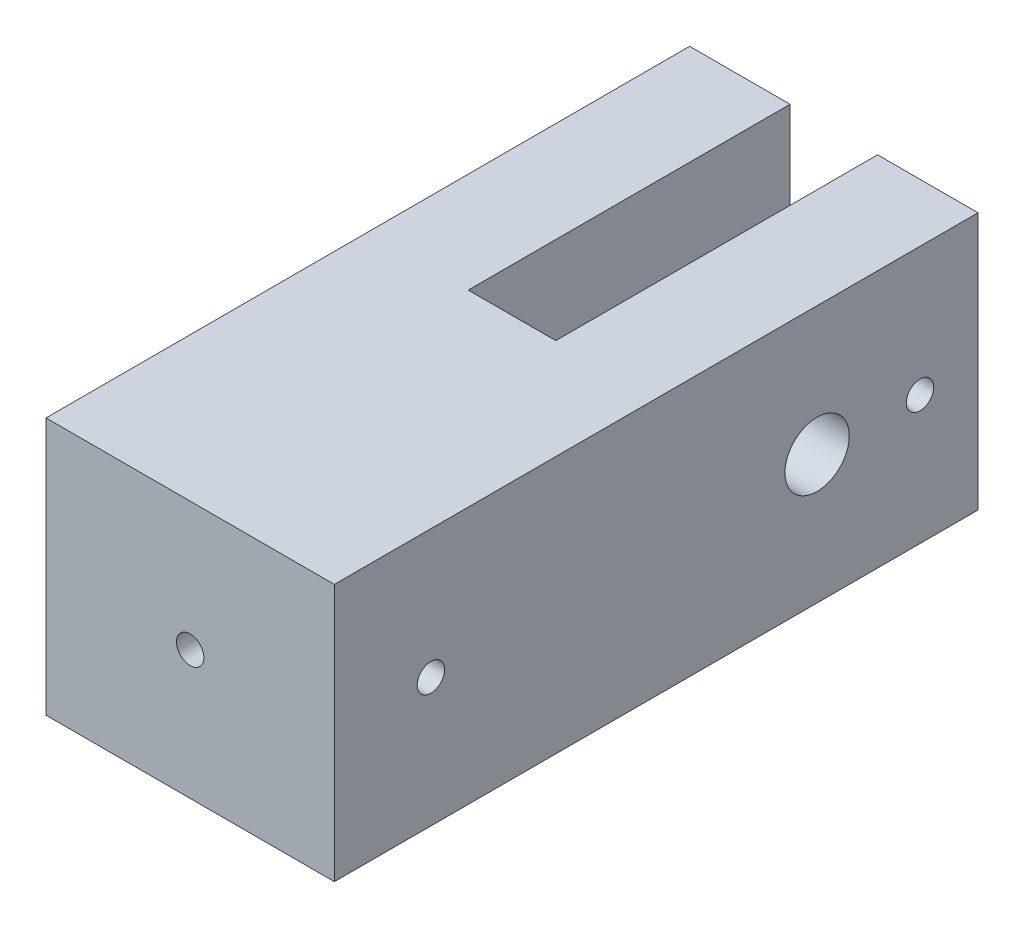
ISO-10303-21;
HEADER;
FILE_DESCRIPTION(('STEP AP214'),'2;1');
FILE_NAME('part.step','',(''),(''),'','','');
FILE_SCHEMA(('AUTOMOTIVE_DESIGN { 1 0 10303 214 1 1 1 1 }'));
ENDSEC;
DATA;
#1=APPLICATION_CONTEXT('core data for automotive mechanical design processes');
#2=APPLICATION_PROTOCOL_DEFINITION('international standard','automotive_design',2000,#1);
#3=PRODUCT_CONTEXT('',#1,'mechanical');
#4=PRODUCT('Part','Part','',(#3));
#5=PRODUCT_RELATED_PRODUCT_CATEGORY('part','',(#4));
#6=PRODUCT_DEFINITION_FORMATION('','',#4);
#7=PRODUCT_DEFINITION_CONTEXT('part definition',#1,'design');
#8=PRODUCT_DEFINITION('design','',#6,#7);
#9=PRODUCT_DEFINITION_SHAPE('','',#8);
#10=(LENGTH_UNIT() NAMED_UNIT(*) SI_UNIT(.MILLI.,.METRE.));
#11=(NAMED_UNIT(*) PLANE_ANGLE_UNIT() SI_UNIT($,.RADIAN.));
#12=(NAMED_UNIT(*) SI_UNIT($,.STERADIAN.) SOLID_ANGLE_UNIT());
#13=UNCERTAINTY_MEASURE_WITH_UNIT(LENGTH_MEASURE(1.E-05),#10,'distance_accuracy_value','');
#14=(GEOMETRIC_REPRESENTATION_CONTEXT(3) GLOBAL_UNCERTAINTY_ASSIGNED_CONTEXT((#13)) GLOBAL_UNIT_ASSIGNED_CONTEXT((#10,
#11,#12)) REPRESENTATION_CONTEXT('',''));
#15=CARTESIAN_POINT('',(0.,0.,0.));
#16=DIRECTION('',(0.,0.,1.));
#17=DIRECTION('',(1.,0.,0.));
#18=AXIS2_PLACEMENT_3D('',#15,#16,#17);
#19=CARTESIAN_POINT('',(0.,0.,0.));
#20=DIRECTION('',(0.,0.,1.));
#21=DIRECTION('',(1.,0.,0.));
#22=AXIS2_PLACEMENT_3D('',#19,#20,#21);
#23=PLANE('',#22);
#24=DIRECTION('',(1.,0.,0.));
#25=VECTOR('',#24,1.);
#26=CARTESIAN_POINT('',(-14.224,-12.7,0.));
#27=LINE('',#26,#25);
#28=CARTESIAN_POINT('',(4.318,-12.7,0.));
#29=VERTEX_POINT('',#28);
#30=CARTESIAN_POINT('',(14.224,-12.7,0.));
#31=VERTEX_POINT('',#30);
#32=EDGE_CURVE('E81',#29,#31,#27,.T.);
#33=ORIENTED_EDGE('',*,*,#32,.F.);
#34=DIRECTION('',(0.,1.,0.));
#35=VECTOR('',#34,1.);
#36=CARTESIAN_POINT('',(4.318,-12.7,0.));
#37=LINE('',#36,#35);
#38=CARTESIAN_POINT('',(4.318,12.7,0.));
#39=VERTEX_POINT('',#38);
#40=EDGE_CURVE('E172',#29,#39,#37,.T.);
#41=ORIENTED_EDGE('',*,*,#40,.T.);
#42=DIRECTION('',(-1.,0.,0.));
#43=VECTOR('',#42,1.);
#44=CARTESIAN_POINT('',(-14.224,12.7,0.));
#45=LINE('',#44,#43);
#46=CARTESIAN_POINT('',(14.224,12.7,0.));
#47=VERTEX_POINT('',#46);
#48=EDGE_CURVE('E199',#47,#39,#45,.T.);
#49=ORIENTED_EDGE('',*,*,#48,.F.);
#50=DIRECTION('',(0.,1.,0.));
#51=VECTOR('',#50,1.);
#52=CARTESIAN_POINT('',(14.224,12.7,0.));
#53=LINE('',#52,#51);
#54=EDGE_CURVE('E181',#31,#47,#53,.T.);
#55=ORIENTED_EDGE('',*,*,#54,.F.);
#56=EDGE_LOOP('',(#33,#41,#49,#55));
#57=FACE_BOUND('',#56,.T.);
#58=ADVANCED_FACE('F35',(#57),#23,.F.);
#59=CARTESIAN_POINT('',(14.224,12.7,63.5));
#60=DIRECTION('',(-1.,0.,0.));
#61=DIRECTION('',(0.,-1.,0.));
#62=AXIS2_PLACEMENT_3D('',#59,#60,#61);
#63=PLANE('',#62);
#64=CARTESIAN_POINT('',(14.224,0.,53.975));
#65=DIRECTION('',(1.,0.,0.));
#66=DIRECTION('',(0.,0.,-1.));
#67=AXIS2_PLACEMENT_3D('',#64,#65,#66);
#68=CIRCLE('',#67,1.35254999999999);
#69=CARTESIAN_POINT('',(14.224,0.,52.62245));
#70=VERTEX_POINT('',#69);
#71=EDGE_CURVE('E131',#70,#70,#68,.T.);
#72=ORIENTED_EDGE('',*,*,#71,.F.);
#73=EDGE_LOOP('',(#72));
#74=FACE_BOUND('',#73,.T.);
#75=CARTESIAN_POINT('',(14.224,0.,5.715));
#76=DIRECTION('',(1.,0.,0.));
#77=DIRECTION('',(0.,0.,-1.));
#78=AXIS2_PLACEMENT_3D('',#75,#76,#77);
#79=CIRCLE('',#78,1.35254999999999);
#80=CARTESIAN_POINT('',(14.224,0.,4.36245000000001));
#81=VERTEX_POINT('',#80);
#82=EDGE_CURVE('E130',#81,#81,#79,.T.);
#83=ORIENTED_EDGE('',*,*,#82,.F.);
#84=EDGE_LOOP('',(#83));
#85=FACE_BOUND('',#84,.T.);
#86=CARTESIAN_POINT('',(14.224,0.,15.875));
#87=DIRECTION('',(-1.,0.,0.));
#88=DIRECTION('',(0.,0.,1.));
#89=AXIS2_PLACEMENT_3D('',#86,#87,#88);
#90=CIRCLE('',#89,3.17500000000001);
#91=CARTESIAN_POINT('',(14.224,0.,19.05));
#92=VERTEX_POINT('',#91);
#93=EDGE_CURVE('E156',#92,#92,#90,.T.);
#94=ORIENTED_EDGE('',*,*,#93,.T.);
#95=EDGE_LOOP('',(#94));
#96=FACE_BOUND('',#95,.T.);
#97=ORIENTED_EDGE('',*,*,#54,.T.);
#98=DIRECTION('',(0.,0.,-1.));
#99=VECTOR('',#98,1.);
#100=CARTESIAN_POINT('',(14.224,12.7,63.5));
#101=LINE('',#100,#99);
#102=CARTESIAN_POINT('',(14.224,12.7,63.5));
#103=VERTEX_POINT('',#102);
#104=EDGE_CURVE('E11',#103,#47,#101,.T.);
#105=ORIENTED_EDGE('',*,*,#104,.F.);
#106=DIRECTION('',(0.,1.,0.));
#107=VECTOR('',#106,1.);
#108=CARTESIAN_POINT('',(14.224,12.7,63.5));
#109=LINE('',#108,#107);
#110=CARTESIAN_POINT('',(14.224,-12.7,63.5));
#111=VERTEX_POINT('',#110);
#112=EDGE_CURVE('E188',#111,#103,#109,.T.);
#113=ORIENTED_EDGE('',*,*,#112,.F.);
#114=DIRECTION('',(0.,0.,-1.));
#115=VECTOR('',#114,1.);
#116=CARTESIAN_POINT('',(14.224,-12.7,63.5));
#117=LINE('',#116,#115);
#118=EDGE_CURVE('E195',#111,#31,#117,.T.);
#119=ORIENTED_EDGE('',*,*,#118,.T.);
#120=EDGE_LOOP('',(#97,#105,#113,#119));
#121=FACE_BOUND('',#120,.T.);
#122=ADVANCED_FACE('F37',(#74,#85,#96,#121),#63,.F.);
#123=CARTESIAN_POINT('',(-14.224,12.7,63.5));
#124=DIRECTION('',(0.,-1.,0.));
#125=DIRECTION('',(0.,0.,-1.));
#126=AXIS2_PLACEMENT_3D('',#123,#124,#125);
#127=PLANE('',#126);
#128=ORIENTED_EDGE('',*,*,#48,.T.);
#129=DIRECTION('',(0.,0.,-1.));
#130=VECTOR('',#129,1.);
#131=CARTESIAN_POINT('',(4.318,12.7,31.75));
#132=LINE('',#131,#130);
#133=CARTESIAN_POINT('',(4.318,12.7,31.75));
#134=VERTEX_POINT('',#133);
#135=EDGE_CURVE('E164',#134,#39,#132,.T.);
#136=ORIENTED_EDGE('',*,*,#135,.F.);
#137=DIRECTION('',(1.,0.,0.));
#138=VECTOR('',#137,1.);
#139=CARTESIAN_POINT('',(-4.318,12.7,31.75));
#140=LINE('',#139,#138);
#141=CARTESIAN_POINT('',(-4.318,12.7,31.75));
#142=VERTEX_POINT('',#141);
#143=EDGE_CURVE('E167',#142,#134,#140,.T.);
#144=ORIENTED_EDGE('',*,*,#143,.F.);
#145=DIRECTION('',(0.,0.,1.));
#146=VECTOR('',#145,1.);
#147=CARTESIAN_POINT('',(-4.318,12.7,31.75));
#148=LINE('',#147,#146);
#149=CARTESIAN_POINT('',(-4.318,12.7,0.));
#150=VERTEX_POINT('',#149);
#151=EDGE_CURVE('E174',#150,#142,#148,.T.);
#152=ORIENTED_EDGE('',*,*,#151,.F.);
#153=CARTESIAN_POINT('',(-14.224,12.7,0.));
#154=VERTEX_POINT('',#153);
#155=EDGE_CURVE('E198',#150,#154,#45,.T.);
#156=ORIENTED_EDGE('',*,*,#155,.T.);
#157=DIRECTION('',(0.,0.,-1.));
#158=VECTOR('',#157,1.);
#159=CARTESIAN_POINT('',(-14.224,12.7,63.5));
#160=LINE('',#159,#158);
#161=CARTESIAN_POINT('',(-14.224,12.7,63.5));
#162=VERTEX_POINT('',#161);
#163=EDGE_CURVE('E44',#162,#154,#160,.T.);
#164=ORIENTED_EDGE('',*,*,#163,.F.);
#165=DIRECTION('',(-1.,0.,0.));
#166=VECTOR('',#165,1.);
#167=CARTESIAN_POINT('',(-14.224,12.7,63.5));
#168=LINE('',#167,#166);
#169=EDGE_CURVE('E88',#103,#162,#168,.T.);
#170=ORIENTED_EDGE('',*,*,#169,.F.);
#171=ORIENTED_EDGE('',*,*,#104,.T.);
#172=EDGE_LOOP('',(#128,#136,#144,#152,#156,#164,#170,#171));
#173=FACE_BOUND('',#172,.T.);
#174=ADVANCED_FACE('F243',(#173),#127,.F.);
#175=CARTESIAN_POINT('',(-14.224,12.7,63.5));
#176=DIRECTION('',(1.,0.,0.));
#177=DIRECTION('',(0.,1.,0.));
#178=AXIS2_PLACEMENT_3D('',#175,#176,#177);
#179=PLANE('',#178);
#180=CARTESIAN_POINT('',(-14.224,0.,5.715));
#181=DIRECTION('',(-1.,0.,0.));
#182=DIRECTION('',(0.,0.,1.));
#183=AXIS2_PLACEMENT_3D('',#180,#181,#182);
#184=CIRCLE('',#183,1.35254999999999);
#185=CARTESIAN_POINT('',(-14.224,0.,7.06754999999999));
#186=VERTEX_POINT('',#185);
#187=EDGE_CURVE('E143',#186,#186,#184,.T.);
#188=ORIENTED_EDGE('',*,*,#187,.F.);
#189=EDGE_LOOP('',(#188));
#190=FACE_BOUND('',#189,.T.);
#191=CARTESIAN_POINT('',(-14.224,0.,53.975));
#192=DIRECTION('',(-1.,0.,0.));
#193=DIRECTION('',(0.,0.,1.));
#194=AXIS2_PLACEMENT_3D('',#191,#192,#193);
#195=CIRCLE('',#194,1.35254999999999);
#196=CARTESIAN_POINT('',(-14.224,0.,55.32755));
#197=VERTEX_POINT('',#196);
#198=EDGE_CURVE('E149',#197,#197,#195,.T.);
#199=ORIENTED_EDGE('',*,*,#198,.F.);
#200=EDGE_LOOP('',(#199));
#201=FACE_BOUND('',#200,.T.);
#202=CARTESIAN_POINT('',(-14.224,0.,15.875));
#203=DIRECTION('',(-1.,0.,0.));
#204=DIRECTION('',(0.,0.,1.));
#205=AXIS2_PLACEMENT_3D('',#202,#203,#204);
#206=CIRCLE('',#205,3.17500000000001);
#207=CARTESIAN_POINT('',(-14.224,0.,19.05));
#208=VERTEX_POINT('',#207);
#209=EDGE_CURVE('E155',#208,#208,#206,.T.);
#210=ORIENTED_EDGE('',*,*,#209,.F.);
#211=EDGE_LOOP('',(#210));
#212=FACE_BOUND('',#211,.T.);
#213=DIRECTION('',(0.,-1.,0.));
#214=VECTOR('',#213,1.);
#215=CARTESIAN_POINT('',(-14.224,12.7,0.));
#216=LINE('',#215,#214);
#217=CARTESIAN_POINT('',(-14.224,-12.7,0.));
#218=VERTEX_POINT('',#217);
#219=EDGE_CURVE('E202',#154,#218,#216,.T.);
#220=ORIENTED_EDGE('',*,*,#219,.T.);
#221=DIRECTION('',(0.,0.,-1.));
#222=VECTOR('',#221,1.);
#223=CARTESIAN_POINT('',(-14.224,-12.7,63.5));
#224=LINE('',#223,#222);
#225=CARTESIAN_POINT('',(-14.224,-12.7,63.5));
#226=VERTEX_POINT('',#225);
#227=EDGE_CURVE('E207',#226,#218,#224,.T.);
#228=ORIENTED_EDGE('',*,*,#227,.F.);
#229=DIRECTION('',(0.,-1.,0.));
#230=VECTOR('',#229,1.);
#231=CARTESIAN_POINT('',(-14.224,12.7,63.5));
#232=LINE('',#231,#230);
#233=EDGE_CURVE('E192',#162,#226,#232,.T.);
#234=ORIENTED_EDGE('',*,*,#233,.F.);
#235=ORIENTED_EDGE('',*,*,#163,.T.);
#236=EDGE_LOOP('',(#220,#228,#234,#235));
#237=FACE_BOUND('',#236,.T.);
#238=ADVANCED_FACE('F214',(#190,#201,#212,#237),#179,.F.);
#239=CARTESIAN_POINT('',(-14.224,-12.7,63.5));
#240=DIRECTION('',(0.,1.,0.));
#241=DIRECTION('',(0.,0.,1.));
#242=AXIS2_PLACEMENT_3D('',#239,#240,#241);
#243=PLANE('',#242);
#244=DIRECTION('',(1.,0.,0.));
#245=VECTOR('',#244,1.);
#246=CARTESIAN_POINT('',(-4.318,-12.7,31.75));
#247=LINE('',#246,#245);
#248=CARTESIAN_POINT('',(-4.318,-12.7,31.75));
#249=VERTEX_POINT('',#248);
#250=CARTESIAN_POINT('',(4.318,-12.7,31.75));
#251=VERTEX_POINT('',#250);
#252=EDGE_CURVE('E169',#249,#251,#247,.T.);
#253=ORIENTED_EDGE('',*,*,#252,.T.);
#254=DIRECTION('',(0.,0.,-1.));
#255=VECTOR('',#254,1.);
#256=CARTESIAN_POINT('',(4.318,-12.7,31.75));
#257=LINE('',#256,#255);
#258=EDGE_CURVE('E165',#251,#29,#257,.T.);
#259=ORIENTED_EDGE('',*,*,#258,.T.);
#260=ORIENTED_EDGE('',*,*,#32,.T.);
#261=ORIENTED_EDGE('',*,*,#118,.F.);
#262=DIRECTION('',(1.,0.,0.));
#263=VECTOR('',#262,1.);
#264=CARTESIAN_POINT('',(-14.224,-12.7,63.5));
#265=LINE('',#264,#263);
#266=EDGE_CURVE('E60',#226,#111,#265,.T.);
#267=ORIENTED_EDGE('',*,*,#266,.F.);
#268=ORIENTED_EDGE('',*,*,#227,.T.);
#269=CARTESIAN_POINT('',(-4.318,-12.7,0.));
#270=VERTEX_POINT('',#269);
#271=EDGE_CURVE('E190',#218,#270,#27,.T.);
#272=ORIENTED_EDGE('',*,*,#271,.T.);
#273=DIRECTION('',(0.,0.,1.));
#274=VECTOR('',#273,1.);
#275=CARTESIAN_POINT('',(-4.318,-12.7,31.75));
#276=LINE('',#275,#274);
#277=EDGE_CURVE('E51',#270,#249,#276,.T.);
#278=ORIENTED_EDGE('',*,*,#277,.T.);
#279=EDGE_LOOP('',(#253,#259,#260,#261,#267,#268,#272,#278));
#280=FACE_BOUND('',#279,.T.);
#281=ADVANCED_FACE('F220',(#280),#243,.F.);
#282=CARTESIAN_POINT('',(0.,0.,63.5));
#283=DIRECTION('',(0.,0.,1.));
#284=DIRECTION('',(1.,0.,0.));
#285=AXIS2_PLACEMENT_3D('',#282,#283,#284);
#286=PLANE('',#285);
#287=CARTESIAN_POINT('',(0.,0.,63.5));
#288=DIRECTION('',(0.,0.,-1.));
#289=DIRECTION('',(-1.,0.,0.));
#290=AXIS2_PLACEMENT_3D('',#287,#288,#289);
#291=CIRCLE('',#290,1.35255);
#292=CARTESIAN_POINT('',(-1.35254999999997,0.,63.5));
#293=VERTEX_POINT('',#292);
#294=EDGE_CURVE('E137',#293,#293,#291,.T.);
#295=ORIENTED_EDGE('',*,*,#294,.T.);
#296=EDGE_LOOP('',(#295));
#297=FACE_BOUND('',#296,.T.);
#298=ORIENTED_EDGE('',*,*,#112,.T.);
#299=ORIENTED_EDGE('',*,*,#169,.T.);
#300=ORIENTED_EDGE('',*,*,#233,.T.);
#301=ORIENTED_EDGE('',*,*,#266,.T.);
#302=EDGE_LOOP('',(#298,#299,#300,#301));
#303=FACE_BOUND('',#302,.T.);
#304=ADVANCED_FACE('F225',(#297,#303),#286,.T.);
#305=ORIENTED_EDGE('',*,*,#155,.F.);
#306=DIRECTION('',(0.,1.,0.));
#307=VECTOR('',#306,1.);
#308=CARTESIAN_POINT('',(-4.318,-12.7,0.));
#309=LINE('',#308,#307);
#310=EDGE_CURVE('E184',#270,#150,#309,.T.);
#311=ORIENTED_EDGE('',*,*,#310,.F.);
#312=ORIENTED_EDGE('',*,*,#271,.F.);
#313=ORIENTED_EDGE('',*,*,#219,.F.);
#314=EDGE_LOOP('',(#305,#311,#312,#313));
#315=FACE_BOUND('',#314,.T.);
#316=ADVANCED_FACE('F219',(#315),#23,.F.);
#317=CARTESIAN_POINT('',(4.318,-12.7,31.75));
#318=DIRECTION('',(1.,0.,0.));
#319=DIRECTION('',(0.,0.,-1.));
#320=AXIS2_PLACEMENT_3D('',#317,#318,#319);
#321=PLANE('',#320);
#322=CARTESIAN_POINT('',(4.318,0.,15.875));
#323=DIRECTION('',(1.,0.,0.));
#324=DIRECTION('',(0.,0.,-1.));
#325=AXIS2_PLACEMENT_3D('',#322,#323,#324);
#326=CIRCLE('',#325,3.17500000000001);
#327=CARTESIAN_POINT('',(4.318,0.,12.7));
#328=VERTEX_POINT('',#327);
#329=EDGE_CURVE('E161',#328,#328,#326,.T.);
#330=ORIENTED_EDGE('',*,*,#329,.T.);
#331=EDGE_LOOP('',(#330));
#332=FACE_BOUND('',#331,.T.);
#333=ORIENTED_EDGE('',*,*,#135,.T.);
#334=ORIENTED_EDGE('',*,*,#40,.F.);
#335=ORIENTED_EDGE('',*,*,#258,.F.);
#336=DIRECTION('',(0.,1.,0.));
#337=VECTOR('',#336,1.);
#338=CARTESIAN_POINT('',(4.318,-12.7,31.75));
#339=LINE('',#338,#337);
#340=EDGE_CURVE('E179',#251,#134,#339,.T.);
#341=ORIENTED_EDGE('',*,*,#340,.T.);
#342=EDGE_LOOP('',(#333,#334,#335,#341));
#343=FACE_BOUND('',#342,.T.);
#344=ADVANCED_FACE('F233',(#332,#343),#321,.F.);
#345=CARTESIAN_POINT('',(-4.318,-12.7,31.75));
#346=DIRECTION('',(0.,0.,1.));
#347=DIRECTION('',(1.,0.,0.));
#348=AXIS2_PLACEMENT_3D('',#345,#346,#347);
#349=PLANE('',#348);
#350=CARTESIAN_POINT('',(0.,0.,31.75));
#351=DIRECTION('',(0.,0.,-1.));
#352=DIRECTION('',(-1.,0.,0.));
#353=AXIS2_PLACEMENT_3D('',#350,#351,#352);
#354=CIRCLE('',#353,1.35254999999999);
#355=CARTESIAN_POINT('',(-1.35254999999996,0.,31.75));
#356=VERTEX_POINT('',#355);
#357=EDGE_CURVE('E320',#356,#356,#354,.T.);
#358=ORIENTED_EDGE('',*,*,#357,.F.);
#359=EDGE_LOOP('',(#358));
#360=FACE_BOUND('',#359,.T.);
#361=ORIENTED_EDGE('',*,*,#143,.T.);
#362=ORIENTED_EDGE('',*,*,#340,.F.);
#363=ORIENTED_EDGE('',*,*,#252,.F.);
#364=DIRECTION('',(0.,1.,0.));
#365=VECTOR('',#364,1.);
#366=CARTESIAN_POINT('',(-4.318,-12.7,31.75));
#367=LINE('',#366,#365);
#368=EDGE_CURVE('E182',#249,#142,#367,.T.);
#369=ORIENTED_EDGE('',*,*,#368,.T.);
#370=EDGE_LOOP('',(#361,#362,#363,#369));
#371=FACE_BOUND('',#370,.T.);
#372=ADVANCED_FACE('F257',(#360,#371),#349,.F.);
#373=CARTESIAN_POINT('',(-4.318,-12.7,31.75));
#374=DIRECTION('',(-1.,0.,0.));
#375=DIRECTION('',(0.,0.,1.));
#376=AXIS2_PLACEMENT_3D('',#373,#374,#375);
#377=PLANE('',#376);
#378=CARTESIAN_POINT('',(-4.318,0.,15.875));
#379=DIRECTION('',(-1.,0.,0.));
#380=DIRECTION('',(0.,0.,1.));
#381=AXIS2_PLACEMENT_3D('',#378,#379,#380);
#382=CIRCLE('',#381,3.17500000000001);
#383=CARTESIAN_POINT('',(-4.318,0.,19.05));
#384=VERTEX_POINT('',#383);
#385=EDGE_CURVE('E39',#384,#384,#382,.T.);
#386=ORIENTED_EDGE('',*,*,#385,.T.);
#387=EDGE_LOOP('',(#386));
#388=FACE_BOUND('',#387,.T.);
#389=ORIENTED_EDGE('',*,*,#151,.T.);
#390=ORIENTED_EDGE('',*,*,#368,.F.);
#391=ORIENTED_EDGE('',*,*,#277,.F.);
#392=ORIENTED_EDGE('',*,*,#310,.T.);
#393=EDGE_LOOP('',(#389,#390,#391,#392));
#394=FACE_BOUND('',#393,.T.);
#395=ADVANCED_FACE('F259',(#388,#394),#377,.F.);
#396=CARTESIAN_POINT('',(14.224,0.,15.875));
#397=DIRECTION('',(-1.,0.,0.));
#398=DIRECTION('',(0.,0.,1.));
#399=AXIS2_PLACEMENT_3D('',#396,#397,#398);
#400=CYLINDRICAL_SURFACE('',#399,3.17500000000001);
#401=ORIENTED_EDGE('',*,*,#209,.T.);
#402=EDGE_LOOP('',(#401));
#403=FACE_BOUND('',#402,.T.);
#404=ORIENTED_EDGE('',*,*,#385,.F.);
#405=EDGE_LOOP('',(#404));
#406=FACE_BOUND('',#405,.T.);
#407=ADVANCED_FACE('F261',(#403,#406),#400,.F.);
#408=ORIENTED_EDGE('',*,*,#93,.F.);
#409=EDGE_LOOP('',(#408));
#410=FACE_BOUND('',#409,.T.);
#411=ORIENTED_EDGE('',*,*,#329,.F.);
#412=EDGE_LOOP('',(#411));
#413=FACE_BOUND('',#412,.T.);
#414=ADVANCED_FACE('F268',(#410,#413),#400,.F.);
#415=CARTESIAN_POINT('',(-7.874,0.,53.975));
#416=DIRECTION('',(-1.,0.,0.));
#417=DIRECTION('',(0.,0.,1.));
#418=AXIS2_PLACEMENT_3D('',#415,#416,#417);
#419=CONICAL_SURFACE('',#418,1.35255,1.02974425867665);
#420=CARTESIAN_POINT('',(-7.06130596973428,0.,53.975));
#421=VERTEX_POINT('',#420);
#422=VERTEX_LOOP('',#421);
#423=FACE_BOUND('',#422,.T.);
#424=CARTESIAN_POINT('',(-7.874,0.,53.975));
#425=DIRECTION('',(-1.,0.,0.));
#426=DIRECTION('',(0.,0.,1.));
#427=AXIS2_PLACEMENT_3D('',#424,#425,#426);
#428=CIRCLE('',#427,1.35255);
#429=CARTESIAN_POINT('',(-7.874,0.,55.32755));
#430=VERTEX_POINT('',#429);
#431=EDGE_CURVE('E152',#430,#430,#428,.T.);
#432=ORIENTED_EDGE('',*,*,#431,.T.);
#433=EDGE_LOOP('',(#432));
#434=FACE_BOUND('',#433,.T.);
#435=ADVANCED_FACE('F281',(#423,#434),#419,.F.);
#436=CARTESIAN_POINT('',(-14.224,0.,53.975));
#437=DIRECTION('',(-1.,0.,0.));
#438=DIRECTION('',(0.,0.,1.));
#439=AXIS2_PLACEMENT_3D('',#436,#437,#438);
#440=CYLINDRICAL_SURFACE('',#439,1.35254999999999);
#441=ORIENTED_EDGE('',*,*,#431,.F.);
#442=EDGE_LOOP('',(#441));
#443=FACE_BOUND('',#442,.T.);
#444=ORIENTED_EDGE('',*,*,#198,.T.);
#445=EDGE_LOOP('',(#444));
#446=FACE_BOUND('',#445,.T.);
#447=ADVANCED_FACE('F286',(#443,#446),#440,.F.);
#448=CARTESIAN_POINT('',(-7.874,0.,5.715));
#449=DIRECTION('',(-1.,0.,0.));
#450=DIRECTION('',(0.,0.,1.));
#451=AXIS2_PLACEMENT_3D('',#448,#449,#450);
#452=CONICAL_SURFACE('',#451,1.35255,1.02974425867665);
#453=CARTESIAN_POINT('',(-7.06130596973428,0.,5.715));
#454=VERTEX_POINT('',#453);
#455=VERTEX_LOOP('',#454);
#456=FACE_BOUND('',#455,.T.);
#457=CARTESIAN_POINT('',(-7.874,0.,5.715));
#458=DIRECTION('',(-1.,0.,0.));
#459=DIRECTION('',(0.,0.,1.));
#460=AXIS2_PLACEMENT_3D('',#457,#458,#459);
#461=CIRCLE('',#460,1.35255);
#462=CARTESIAN_POINT('',(-7.874,0.,7.06755));
#463=VERTEX_POINT('',#462);
#464=EDGE_CURVE('E146',#463,#463,#461,.T.);
#465=ORIENTED_EDGE('',*,*,#464,.T.);
#466=EDGE_LOOP('',(#465));
#467=FACE_BOUND('',#466,.T.);
#468=ADVANCED_FACE('F293',(#456,#467),#452,.F.);
#469=CARTESIAN_POINT('',(-14.224,0.,5.715));
#470=DIRECTION('',(-1.,0.,0.));
#471=DIRECTION('',(0.,0.,1.));
#472=AXIS2_PLACEMENT_3D('',#469,#470,#471);
#473=CYLINDRICAL_SURFACE('',#472,1.35254999999999);
#474=ORIENTED_EDGE('',*,*,#464,.F.);
#475=EDGE_LOOP('',(#474));
#476=FACE_BOUND('',#475,.T.);
#477=ORIENTED_EDGE('',*,*,#187,.T.);
#478=EDGE_LOOP('',(#477));
#479=FACE_BOUND('',#478,.T.);
#480=ADVANCED_FACE('F297',(#476,#479),#473,.F.);
#481=CARTESIAN_POINT('',(7.874,0.,5.715));
#482=DIRECTION('',(1.,0.,0.));
#483=DIRECTION('',(0.,0.,-1.));
#484=AXIS2_PLACEMENT_3D('',#481,#482,#483);
#485=CONICAL_SURFACE('',#484,1.35255,1.02974425867665);
#486=CARTESIAN_POINT('',(7.06130596973427,0.,5.715));
#487=VERTEX_POINT('',#486);
#488=VERTEX_LOOP('',#487);
#489=FACE_BOUND('',#488,.T.);
#490=CARTESIAN_POINT('',(7.874,0.,5.715));
#491=DIRECTION('',(1.,0.,0.));
#492=DIRECTION('',(0.,0.,-1.));
#493=AXIS2_PLACEMENT_3D('',#490,#491,#492);
#494=CIRCLE('',#493,1.35255);
#495=CARTESIAN_POINT('',(7.874,0.,4.36245));
#496=VERTEX_POINT('',#495);
#497=EDGE_CURVE('E134',#496,#496,#494,.T.);
#498=ORIENTED_EDGE('',*,*,#497,.T.);
#499=EDGE_LOOP('',(#498));
#500=FACE_BOUND('',#499,.T.);
#501=ADVANCED_FACE('F301',(#489,#500),#485,.F.);
#502=CARTESIAN_POINT('',(14.224,0.,5.715));
#503=DIRECTION('',(1.,0.,0.));
#504=DIRECTION('',(0.,0.,-1.));
#505=AXIS2_PLACEMENT_3D('',#502,#503,#504);
#506=CYLINDRICAL_SURFACE('',#505,1.35254999999999);
#507=ORIENTED_EDGE('',*,*,#497,.F.);
#508=EDGE_LOOP('',(#507));
#509=FACE_BOUND('',#508,.T.);
#510=ORIENTED_EDGE('',*,*,#82,.T.);
#511=EDGE_LOOP('',(#510));
#512=FACE_BOUND('',#511,.T.);
#513=ADVANCED_FACE('F124',(#509,#512),#506,.F.);
#514=CARTESIAN_POINT('',(7.874,0.,53.975));
#515=DIRECTION('',(1.,0.,0.));
#516=DIRECTION('',(0.,0.,-1.));
#517=AXIS2_PLACEMENT_3D('',#514,#515,#516);
#518=CONICAL_SURFACE('',#517,1.35255,1.02974425867665);
#519=CARTESIAN_POINT('',(7.06130596973427,0.,53.975));
#520=VERTEX_POINT('',#519);
#521=VERTEX_LOOP('',#520);
#522=FACE_BOUND('',#521,.T.);
#523=CARTESIAN_POINT('',(7.874,0.,53.975));
#524=DIRECTION('',(1.,0.,0.));
#525=DIRECTION('',(0.,0.,-1.));
#526=AXIS2_PLACEMENT_3D('',#523,#524,#525);
#527=CIRCLE('',#526,1.35255);
#528=CARTESIAN_POINT('',(7.874,0.,52.62245));
#529=VERTEX_POINT('',#528);
#530=EDGE_CURVE('E128',#529,#529,#527,.T.);
#531=ORIENTED_EDGE('',*,*,#530,.T.);
#532=EDGE_LOOP('',(#531));
#533=FACE_BOUND('',#532,.T.);
#534=ADVANCED_FACE('F120',(#522,#533),#518,.F.);
#535=CARTESIAN_POINT('',(14.224,0.,53.975));
#536=DIRECTION('',(1.,0.,0.));
#537=DIRECTION('',(0.,0.,-1.));
#538=AXIS2_PLACEMENT_3D('',#535,#536,#537);
#539=CYLINDRICAL_SURFACE('',#538,1.35254999999999);
#540=ORIENTED_EDGE('',*,*,#530,.F.);
#541=EDGE_LOOP('',(#540));
#542=FACE_BOUND('',#541,.T.);
#543=ORIENTED_EDGE('',*,*,#71,.T.);
#544=EDGE_LOOP('',(#543));
#545=FACE_BOUND('',#544,.T.);
#546=ADVANCED_FACE('F123',(#542,#545),#539,.F.);
#547=CARTESIAN_POINT('',(0.,0.,31.75));
#548=DIRECTION('',(0.,0.,-1.));
#549=DIRECTION('',(-1.,0.,0.));
#550=AXIS2_PLACEMENT_3D('',#547,#548,#549);
#551=CYLINDRICAL_SURFACE('',#550,1.35254999999999);
#552=ORIENTED_EDGE('',*,*,#294,.F.);
#553=EDGE_LOOP('',(#552));
#554=FACE_BOUND('',#553,.T.);
#555=ORIENTED_EDGE('',*,*,#357,.T.);
#556=EDGE_LOOP('',(#555));
#557=FACE_BOUND('',#556,.T.);
#558=ADVANCED_FACE('F311',(#554,#557),#551,.F.);
#559=CLOSED_SHELL('',(#58,#122,#174,#238,#281,#304,#316,#344,#372,#395,#407,#414,#435,#447,#468,
#480,#501,#513,#534,#546,#558));
#560=MANIFOLD_SOLID_BREP('B2',#559);
#561=ADVANCED_BREP_SHAPE_REPRESENTATION('',(#18,#560),#14);
#562=SHAPE_DEFINITION_REPRESENTATION(#9,#561);
ENDSEC;
END-ISO-10303-21;
